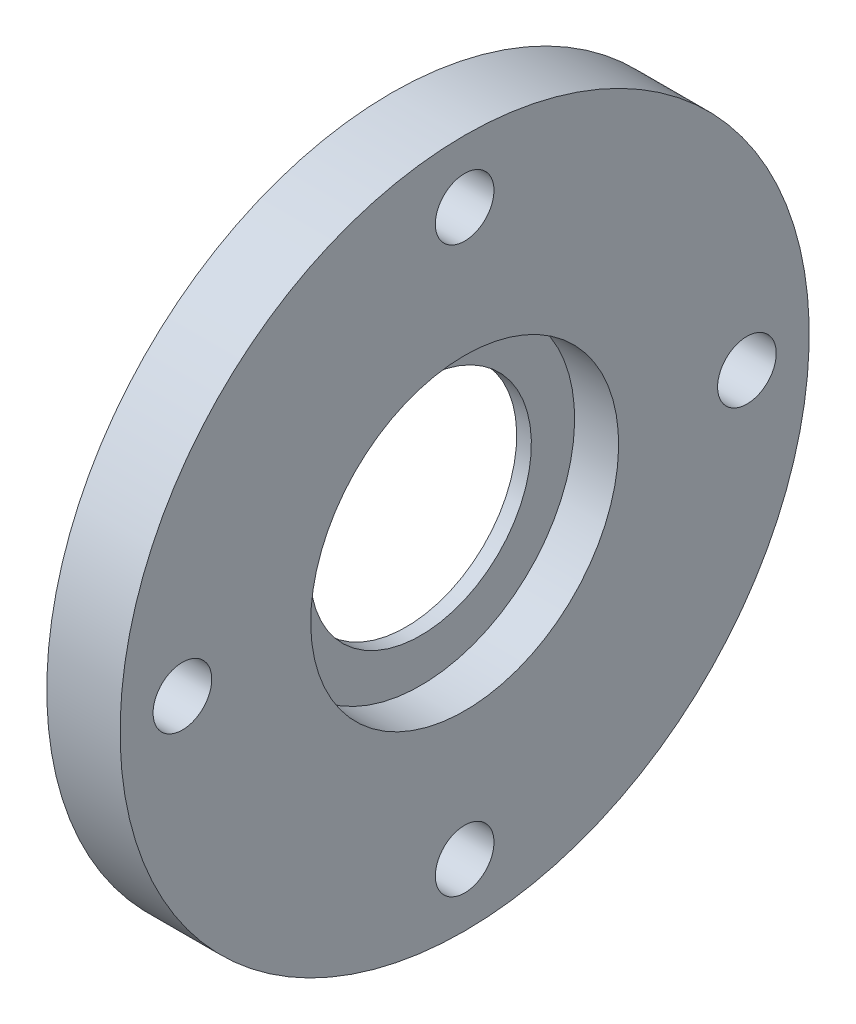
ISO-10303-21;
HEADER;
FILE_DESCRIPTION(('STEP AP214'),'2;1');
FILE_NAME('part.step','',(''),(''),'','','');
FILE_SCHEMA(('AUTOMOTIVE_DESIGN { 1 0 10303 214 1 1 1 1 }'));
ENDSEC;
DATA;
#1=APPLICATION_CONTEXT('core data for automotive mechanical design processes');
#2=APPLICATION_PROTOCOL_DEFINITION('international standard','automotive_design',2000,#1);
#3=PRODUCT_CONTEXT('',#1,'mechanical');
#4=PRODUCT('Part','Part','',(#3));
#5=PRODUCT_RELATED_PRODUCT_CATEGORY('part','',(#4));
#6=PRODUCT_DEFINITION_FORMATION('','',#4);
#7=PRODUCT_DEFINITION_CONTEXT('part definition',#1,'design');
#8=PRODUCT_DEFINITION('design','',#6,#7);
#9=PRODUCT_DEFINITION_SHAPE('','',#8);
#10=(LENGTH_UNIT() NAMED_UNIT(*) SI_UNIT(.MILLI.,.METRE.));
#11=(NAMED_UNIT(*) PLANE_ANGLE_UNIT() SI_UNIT($,.RADIAN.));
#12=(NAMED_UNIT(*) SI_UNIT($,.STERADIAN.) SOLID_ANGLE_UNIT());
#13=UNCERTAINTY_MEASURE_WITH_UNIT(LENGTH_MEASURE(1.E-05),#10,'distance_accuracy_value','');
#14=(GEOMETRIC_REPRESENTATION_CONTEXT(3) GLOBAL_UNCERTAINTY_ASSIGNED_CONTEXT((#13)) GLOBAL_UNIT_ASSIGNED_CONTEXT((#10,
#11,#12)) REPRESENTATION_CONTEXT('',''));
#15=CARTESIAN_POINT('',(0.,0.,0.));
#16=DIRECTION('',(0.,0.,1.));
#17=DIRECTION('',(1.,0.,0.));
#18=AXIS2_PLACEMENT_3D('',#15,#16,#17);
#19=CARTESIAN_POINT('',(-1.,0.,0.));
#20=DIRECTION('',(1.,0.,0.));
#21=DIRECTION('',(0.,1.,0.));
#22=AXIS2_PLACEMENT_3D('',#19,#20,#21);
#23=PLANE('',#22);
#24=CARTESIAN_POINT('',(-1.,0.,0.));
#25=DIRECTION('',(1.,0.,0.));
#26=DIRECTION('',(0.,-1.,0.));
#27=AXIS2_PLACEMENT_3D('',#24,#25,#26);
#28=CIRCLE('',#27,7.55);
#29=CARTESIAN_POINT('',(-1.,7.55,0.));
#30=VERTEX_POINT('',#29);
#31=EDGE_CURVE('E179',#30,#30,#28,.T.);
#32=ORIENTED_EDGE('',*,*,#31,.T.);
#33=EDGE_LOOP('',(#32));
#34=FACE_BOUND('',#33,.T.);
#35=CARTESIAN_POINT('',(-1.,0.,0.));
#36=DIRECTION('',(-1.,0.,0.));
#37=DIRECTION('',(0.,0.,-1.));
#38=AXIS2_PLACEMENT_3D('',#35,#36,#37);
#39=CIRCLE('',#38,14.);
#40=CARTESIAN_POINT('',(-1.,0.,14.));
#41=VERTEX_POINT('',#40);
#42=EDGE_CURVE('E139',#41,#41,#39,.T.);
#43=ORIENTED_EDGE('',*,*,#42,.T.);
#44=EDGE_LOOP('',(#43));
#45=FACE_BOUND('',#44,.T.);
#46=ADVANCED_FACE('F17',(#34,#45),#23,.F.);
#47=CARTESIAN_POINT('',(0.,0.,0.));
#48=DIRECTION('',(1.,0.,0.));
#49=DIRECTION('',(0.,1.,0.));
#50=AXIS2_PLACEMENT_3D('',#47,#48,#49);
#51=PLANE('',#50);
#52=CARTESIAN_POINT('',(0.,0.,0.));
#53=DIRECTION('',(-1.,0.,0.));
#54=DIRECTION('',(0.,-1.,0.));
#55=AXIS2_PLACEMENT_3D('',#52,#53,#54);
#56=CIRCLE('',#55,7.55);
#57=CARTESIAN_POINT('',(0.,7.55,0.));
#58=VERTEX_POINT('',#57);
#59=EDGE_CURVE('E20',#58,#58,#56,.T.);
#60=ORIENTED_EDGE('',*,*,#59,.T.);
#61=EDGE_LOOP('',(#60));
#62=FACE_BOUND('',#61,.T.);
#63=CARTESIAN_POINT('',(0.,0.,0.));
#64=DIRECTION('',(1.,0.,0.));
#65=DIRECTION('',(0.,-1.,0.));
#66=AXIS2_PLACEMENT_3D('',#63,#64,#65);
#67=CIRCLE('',#66,10.5);
#68=CARTESIAN_POINT('',(0.,10.5,0.));
#69=VERTEX_POINT('',#68);
#70=EDGE_CURVE('E159',#69,#69,#67,.T.);
#71=ORIENTED_EDGE('',*,*,#70,.T.);
#72=EDGE_LOOP('',(#71));
#73=FACE_BOUND('',#72,.T.);
#74=ADVANCED_FACE('F285',(#62,#73),#51,.T.);
#75=CARTESIAN_POINT('',(0.,0.,0.));
#76=DIRECTION('',(-1.,0.,0.));
#77=DIRECTION('',(0.,1.,0.));
#78=AXIS2_PLACEMENT_3D('',#75,#76,#77);
#79=CYLINDRICAL_SURFACE('',#78,23.5);
#80=CARTESIAN_POINT('',(-2.,0.,0.));
#81=DIRECTION('',(-1.,0.,0.));
#82=DIRECTION('',(0.,0.,1.));
#83=AXIS2_PLACEMENT_3D('',#80,#81,#82);
#84=CIRCLE('',#83,23.5);
#85=CARTESIAN_POINT('',(-2.,-23.5,0.));
#86=VERTEX_POINT('',#85);
#87=EDGE_CURVE('E129',#86,#86,#84,.T.);
#88=ORIENTED_EDGE('',*,*,#87,.F.);
#89=DIRECTION('',(1.,0.,0.));
#90=VECTOR('',#89,1.);
#91=CARTESIAN_POINT('',(0.,-23.5,0.));
#92=LINE('',#91,#90);
#93=CARTESIAN_POINT('',(3.,-23.5,0.));
#94=VERTEX_POINT('',#93);
#95=EDGE_CURVE('E11',#86,#94,#92,.T.);
#96=ORIENTED_EDGE('',*,*,#95,.T.);
#97=CARTESIAN_POINT('',(3.,0.,0.));
#98=DIRECTION('',(1.,0.,0.));
#99=DIRECTION('',(0.,1.,0.));
#100=AXIS2_PLACEMENT_3D('',#97,#98,#99);
#101=CIRCLE('',#100,23.5);
#102=EDGE_CURVE('E161',#94,#94,#101,.T.);
#103=ORIENTED_EDGE('',*,*,#102,.F.);
#104=ORIENTED_EDGE('',*,*,#95,.F.);
#105=EDGE_LOOP('',(#88,#96,#103,#104));
#106=FACE_BOUND('',#105,.T.);
#107=ADVANCED_FACE('F287',(#106),#79,.T.);
#108=CARTESIAN_POINT('',(0.,0.,-19.25));
#109=DIRECTION('',(-1.,0.,0.));
#110=DIRECTION('',(0.,-1.,0.));
#111=AXIS2_PLACEMENT_3D('',#108,#109,#110);
#112=CYLINDRICAL_SURFACE('',#111,2.);
#113=CARTESIAN_POINT('',(-2.,0.,-19.25));
#114=DIRECTION('',(1.,0.,0.));
#115=DIRECTION('',(0.,0.,1.));
#116=AXIS2_PLACEMENT_3D('',#113,#114,#115);
#117=CIRCLE('',#116,2.);
#118=CARTESIAN_POINT('',(-2.,2.,-19.25));
#119=VERTEX_POINT('',#118);
#120=EDGE_CURVE('E137',#119,#119,#117,.T.);
#121=ORIENTED_EDGE('',*,*,#120,.F.);
#122=DIRECTION('',(1.,0.,0.));
#123=VECTOR('',#122,1.);
#124=CARTESIAN_POINT('',(0.,2.,-19.25));
#125=LINE('',#124,#123);
#126=CARTESIAN_POINT('',(3.,2.,-19.25));
#127=VERTEX_POINT('',#126);
#128=EDGE_CURVE('E27',#119,#127,#125,.T.);
#129=ORIENTED_EDGE('',*,*,#128,.T.);
#130=CARTESIAN_POINT('',(3.,0.,-19.25));
#131=DIRECTION('',(-1.,0.,0.));
#132=DIRECTION('',(0.,-1.,0.));
#133=AXIS2_PLACEMENT_3D('',#130,#131,#132);
#134=CIRCLE('',#133,2.);
#135=EDGE_CURVE('E181',#127,#127,#134,.T.);
#136=ORIENTED_EDGE('',*,*,#135,.F.);
#137=ORIENTED_EDGE('',*,*,#128,.F.);
#138=EDGE_LOOP('',(#121,#129,#136,#137));
#139=FACE_BOUND('',#138,.T.);
#140=ADVANCED_FACE('F295',(#139),#112,.F.);
#141=CARTESIAN_POINT('',(0.,19.25,0.));
#142=DIRECTION('',(-1.,0.,0.));
#143=DIRECTION('',(0.,-1.,0.));
#144=AXIS2_PLACEMENT_3D('',#141,#142,#143);
#145=CYLINDRICAL_SURFACE('',#144,2.);
#146=CARTESIAN_POINT('',(-2.,19.25,0.));
#147=DIRECTION('',(1.,0.,0.));
#148=DIRECTION('',(0.,0.,1.));
#149=AXIS2_PLACEMENT_3D('',#146,#147,#148);
#150=CIRCLE('',#149,2.);
#151=CARTESIAN_POINT('',(-2.,21.25,0.));
#152=VERTEX_POINT('',#151);
#153=EDGE_CURVE('E143',#152,#152,#150,.T.);
#154=ORIENTED_EDGE('',*,*,#153,.F.);
#155=DIRECTION('',(1.,0.,0.));
#156=VECTOR('',#155,1.);
#157=CARTESIAN_POINT('',(0.,21.25,0.));
#158=LINE('',#157,#156);
#159=CARTESIAN_POINT('',(3.,21.25,0.));
#160=VERTEX_POINT('',#159);
#161=EDGE_CURVE('E163',#152,#160,#158,.T.);
#162=ORIENTED_EDGE('',*,*,#161,.T.);
#163=CARTESIAN_POINT('',(3.,19.25,0.));
#164=DIRECTION('',(-1.,0.,0.));
#165=DIRECTION('',(0.,-1.,0.));
#166=AXIS2_PLACEMENT_3D('',#163,#164,#165);
#167=CIRCLE('',#166,2.);
#168=EDGE_CURVE('E184',#160,#160,#167,.T.);
#169=ORIENTED_EDGE('',*,*,#168,.F.);
#170=ORIENTED_EDGE('',*,*,#161,.F.);
#171=EDGE_LOOP('',(#154,#162,#169,#170));
#172=FACE_BOUND('',#171,.T.);
#173=ADVANCED_FACE('F311',(#172),#145,.F.);
#174=CARTESIAN_POINT('',(0.,0.,19.25));
#175=DIRECTION('',(-1.,0.,0.));
#176=DIRECTION('',(0.,-1.,0.));
#177=AXIS2_PLACEMENT_3D('',#174,#175,#176);
#178=CYLINDRICAL_SURFACE('',#177,2.);
#179=CARTESIAN_POINT('',(-2.,0.,19.25));
#180=DIRECTION('',(1.,0.,0.));
#181=DIRECTION('',(0.,0.,1.));
#182=AXIS2_PLACEMENT_3D('',#179,#180,#181);
#183=CIRCLE('',#182,2.);
#184=CARTESIAN_POINT('',(-2.,2.,19.25));
#185=VERTEX_POINT('',#184);
#186=EDGE_CURVE('E128',#185,#185,#183,.T.);
#187=ORIENTED_EDGE('',*,*,#186,.F.);
#188=DIRECTION('',(1.,0.,0.));
#189=VECTOR('',#188,1.);
#190=CARTESIAN_POINT('',(0.,2.,19.25));
#191=LINE('',#190,#189);
#192=CARTESIAN_POINT('',(3.,2.,19.25));
#193=VERTEX_POINT('',#192);
#194=EDGE_CURVE('E85',#185,#193,#191,.T.);
#195=ORIENTED_EDGE('',*,*,#194,.T.);
#196=CARTESIAN_POINT('',(3.,0.,19.25));
#197=DIRECTION('',(-1.,0.,0.));
#198=DIRECTION('',(0.,-1.,0.));
#199=AXIS2_PLACEMENT_3D('',#196,#197,#198);
#200=CIRCLE('',#199,2.);
#201=EDGE_CURVE('E185',#193,#193,#200,.T.);
#202=ORIENTED_EDGE('',*,*,#201,.F.);
#203=ORIENTED_EDGE('',*,*,#194,.F.);
#204=EDGE_LOOP('',(#187,#195,#202,#203));
#205=FACE_BOUND('',#204,.T.);
#206=ADVANCED_FACE('F302',(#205),#178,.F.);
#207=CARTESIAN_POINT('',(0.,-19.25,0.));
#208=DIRECTION('',(-1.,0.,0.));
#209=DIRECTION('',(0.,-1.,0.));
#210=AXIS2_PLACEMENT_3D('',#207,#208,#209);
#211=CYLINDRICAL_SURFACE('',#210,2.);
#212=CARTESIAN_POINT('',(-2.,-19.25,0.));
#213=DIRECTION('',(1.,0.,0.));
#214=DIRECTION('',(0.,0.,1.));
#215=AXIS2_PLACEMENT_3D('',#212,#213,#214);
#216=CIRCLE('',#215,2.);
#217=CARTESIAN_POINT('',(-2.,-17.25,0.));
#218=VERTEX_POINT('',#217);
#219=EDGE_CURVE('E120',#218,#218,#216,.T.);
#220=ORIENTED_EDGE('',*,*,#219,.F.);
#221=DIRECTION('',(1.,0.,0.));
#222=VECTOR('',#221,1.);
#223=CARTESIAN_POINT('',(0.,-17.25,0.));
#224=LINE('',#223,#222);
#225=CARTESIAN_POINT('',(3.,-17.25,0.));
#226=VERTEX_POINT('',#225);
#227=EDGE_CURVE('E74',#218,#226,#224,.T.);
#228=ORIENTED_EDGE('',*,*,#227,.T.);
#229=CARTESIAN_POINT('',(3.,-19.25,0.));
#230=DIRECTION('',(-1.,0.,0.));
#231=DIRECTION('',(0.,-1.,0.));
#232=AXIS2_PLACEMENT_3D('',#229,#230,#231);
#233=CIRCLE('',#232,2.);
#234=EDGE_CURVE('E121',#226,#226,#233,.T.);
#235=ORIENTED_EDGE('',*,*,#234,.F.);
#236=ORIENTED_EDGE('',*,*,#227,.F.);
#237=EDGE_LOOP('',(#220,#228,#235,#236));
#238=FACE_BOUND('',#237,.T.);
#239=ADVANCED_FACE('F119',(#238),#211,.F.);
#240=CARTESIAN_POINT('',(0.,0.,0.));
#241=DIRECTION('',(-1.,0.,0.));
#242=DIRECTION('',(0.,-1.,0.));
#243=AXIS2_PLACEMENT_3D('',#240,#241,#242);
#244=CYLINDRICAL_SURFACE('',#243,7.55);
#245=ORIENTED_EDGE('',*,*,#31,.F.);
#246=DIRECTION('',(1.,0.,0.));
#247=VECTOR('',#246,1.);
#248=CARTESIAN_POINT('',(0.,7.55,0.));
#249=LINE('',#248,#247);
#250=EDGE_CURVE('E199',#30,#58,#249,.T.);
#251=ORIENTED_EDGE('',*,*,#250,.T.);
#252=ORIENTED_EDGE('',*,*,#59,.F.);
#253=ORIENTED_EDGE('',*,*,#250,.F.);
#254=EDGE_LOOP('',(#245,#251,#252,#253));
#255=FACE_BOUND('',#254,.T.);
#256=ADVANCED_FACE('F301',(#255),#244,.F.);
#257=CARTESIAN_POINT('',(3.,0.,0.));
#258=DIRECTION('',(1.,0.,0.));
#259=DIRECTION('',(0.,1.,0.));
#260=AXIS2_PLACEMENT_3D('',#257,#258,#259);
#261=PLANE('',#260);
#262=ORIENTED_EDGE('',*,*,#234,.T.);
#263=EDGE_LOOP('',(#262));
#264=FACE_BOUND('',#263,.T.);
#265=CARTESIAN_POINT('',(3.,0.,0.));
#266=DIRECTION('',(-1.,0.,0.));
#267=DIRECTION('',(0.,-1.,0.));
#268=AXIS2_PLACEMENT_3D('',#265,#266,#267);
#269=CIRCLE('',#268,10.5);
#270=CARTESIAN_POINT('',(3.,10.5,0.));
#271=VERTEX_POINT('',#270);
#272=EDGE_CURVE('E147',#271,#271,#269,.T.);
#273=ORIENTED_EDGE('',*,*,#272,.T.);
#274=EDGE_LOOP('',(#273));
#275=FACE_BOUND('',#274,.T.);
#276=ORIENTED_EDGE('',*,*,#201,.T.);
#277=EDGE_LOOP('',(#276));
#278=FACE_BOUND('',#277,.T.);
#279=ORIENTED_EDGE('',*,*,#168,.T.);
#280=EDGE_LOOP('',(#279));
#281=FACE_BOUND('',#280,.T.);
#282=ORIENTED_EDGE('',*,*,#135,.T.);
#283=EDGE_LOOP('',(#282));
#284=FACE_BOUND('',#283,.T.);
#285=ORIENTED_EDGE('',*,*,#102,.T.);
#286=EDGE_LOOP('',(#285));
#287=FACE_BOUND('',#286,.T.);
#288=ADVANCED_FACE('F308',(#264,#275,#278,#281,#284,#287),#261,.T.);
#289=CARTESIAN_POINT('',(0.,0.,0.));
#290=DIRECTION('',(1.,0.,0.));
#291=DIRECTION('',(0.,-1.,0.));
#292=AXIS2_PLACEMENT_3D('',#289,#290,#291);
#293=CYLINDRICAL_SURFACE('',#292,10.5);
#294=ORIENTED_EDGE('',*,*,#272,.F.);
#295=DIRECTION('',(-1.,0.,0.));
#296=VECTOR('',#295,1.);
#297=CARTESIAN_POINT('',(0.,10.5,0.));
#298=LINE('',#297,#296);
#299=EDGE_CURVE('E162',#271,#69,#298,.T.);
#300=ORIENTED_EDGE('',*,*,#299,.T.);
#301=ORIENTED_EDGE('',*,*,#70,.F.);
#302=ORIENTED_EDGE('',*,*,#299,.F.);
#303=EDGE_LOOP('',(#294,#300,#301,#302));
#304=FACE_BOUND('',#303,.T.);
#305=ADVANCED_FACE('F226',(#304),#293,.F.);
#306=CARTESIAN_POINT('',(-2.,0.,0.));
#307=DIRECTION('',(-1.,0.,0.));
#308=DIRECTION('',(0.,0.,1.));
#309=AXIS2_PLACEMENT_3D('',#306,#307,#308);
#310=PLANE('',#309);
#311=CARTESIAN_POINT('',(-2.,0.,0.));
#312=DIRECTION('',(1.,0.,0.));
#313=DIRECTION('',(0.,0.,1.));
#314=AXIS2_PLACEMENT_3D('',#311,#312,#313);
#315=CIRCLE('',#314,16.);
#316=CARTESIAN_POINT('',(-2.,0.,-16.));
#317=VERTEX_POINT('',#316);
#318=EDGE_CURVE('E152',#317,#317,#315,.T.);
#319=ORIENTED_EDGE('',*,*,#318,.T.);
#320=EDGE_LOOP('',(#319));
#321=FACE_BOUND('',#320,.T.);
#322=ORIENTED_EDGE('',*,*,#153,.T.);
#323=EDGE_LOOP('',(#322));
#324=FACE_BOUND('',#323,.T.);
#325=ORIENTED_EDGE('',*,*,#120,.T.);
#326=EDGE_LOOP('',(#325));
#327=FACE_BOUND('',#326,.T.);
#328=ORIENTED_EDGE('',*,*,#186,.T.);
#329=EDGE_LOOP('',(#328));
#330=FACE_BOUND('',#329,.T.);
#331=ORIENTED_EDGE('',*,*,#219,.T.);
#332=EDGE_LOOP('',(#331));
#333=FACE_BOUND('',#332,.T.);
#334=ORIENTED_EDGE('',*,*,#87,.T.);
#335=EDGE_LOOP('',(#334));
#336=FACE_BOUND('',#335,.T.);
#337=ADVANCED_FACE('F125',(#321,#324,#327,#330,#333,#336),#310,.T.);
#338=CARTESIAN_POINT('',(-1.,0.,0.));
#339=DIRECTION('',(-1.,0.,0.));
#340=DIRECTION('',(0.,0.,-1.));
#341=AXIS2_PLACEMENT_3D('',#338,#339,#340);
#342=CYLINDRICAL_SURFACE('',#341,14.);
#343=CARTESIAN_POINT('',(-3.,0.,0.));
#344=DIRECTION('',(1.,0.,0.));
#345=DIRECTION('',(0.,0.,-1.));
#346=AXIS2_PLACEMENT_3D('',#343,#344,#345);
#347=CIRCLE('',#346,14.);
#348=CARTESIAN_POINT('',(-3.,0.,14.));
#349=VERTEX_POINT('',#348);
#350=EDGE_CURVE('E154',#349,#349,#347,.T.);
#351=ORIENTED_EDGE('',*,*,#350,.F.);
#352=DIRECTION('',(1.,0.,0.));
#353=VECTOR('',#352,1.);
#354=CARTESIAN_POINT('',(-1.,0.,14.));
#355=LINE('',#354,#353);
#356=EDGE_CURVE('E157',#349,#41,#355,.T.);
#357=ORIENTED_EDGE('',*,*,#356,.T.);
#358=ORIENTED_EDGE('',*,*,#42,.F.);
#359=ORIENTED_EDGE('',*,*,#356,.F.);
#360=EDGE_LOOP('',(#351,#357,#358,#359));
#361=FACE_BOUND('',#360,.T.);
#362=ADVANCED_FACE('F323',(#361),#342,.F.);
#363=CARTESIAN_POINT('',(-3.,0.,0.));
#364=DIRECTION('',(-1.,0.,0.));
#365=DIRECTION('',(0.,0.,1.));
#366=AXIS2_PLACEMENT_3D('',#363,#364,#365);
#367=PLANE('',#366);
#368=ORIENTED_EDGE('',*,*,#350,.T.);
#369=EDGE_LOOP('',(#368));
#370=FACE_BOUND('',#369,.T.);
#371=CARTESIAN_POINT('',(-3.,0.,0.));
#372=DIRECTION('',(-1.,0.,0.));
#373=DIRECTION('',(0.,0.,1.));
#374=AXIS2_PLACEMENT_3D('',#371,#372,#373);
#375=CIRCLE('',#374,16.);
#376=CARTESIAN_POINT('',(-3.,0.,-16.));
#377=VERTEX_POINT('',#376);
#378=EDGE_CURVE('E153',#377,#377,#375,.T.);
#379=ORIENTED_EDGE('',*,*,#378,.T.);
#380=EDGE_LOOP('',(#379));
#381=FACE_BOUND('',#380,.T.);
#382=ADVANCED_FACE('F321',(#370,#381),#367,.T.);
#383=CARTESIAN_POINT('',(-2.,0.,0.));
#384=DIRECTION('',(-1.,0.,0.));
#385=DIRECTION('',(0.,0.,1.));
#386=AXIS2_PLACEMENT_3D('',#383,#384,#385);
#387=CYLINDRICAL_SURFACE('',#386,16.);
#388=ORIENTED_EDGE('',*,*,#378,.F.);
#389=DIRECTION('',(1.,0.,0.));
#390=VECTOR('',#389,1.);
#391=CARTESIAN_POINT('',(-2.,0.,-16.));
#392=LINE('',#391,#390);
#393=EDGE_CURVE('E148',#377,#317,#392,.T.);
#394=ORIENTED_EDGE('',*,*,#393,.T.);
#395=ORIENTED_EDGE('',*,*,#318,.F.);
#396=ORIENTED_EDGE('',*,*,#393,.F.);
#397=EDGE_LOOP('',(#388,#394,#395,#396));
#398=FACE_BOUND('',#397,.T.);
#399=ADVANCED_FACE('F319',(#398),#387,.T.);
#400=CLOSED_SHELL('',(#46,#74,#107,#140,#173,#206,#239,#256,#288,#305,#337,#362,#382,#399));
#401=MANIFOLD_SOLID_BREP('B1',#400);
#402=ADVANCED_BREP_SHAPE_REPRESENTATION('',(#18,#401),#14);
#403=SHAPE_DEFINITION_REPRESENTATION(#9,#402);
ENDSEC;
END-ISO-10303-21;
